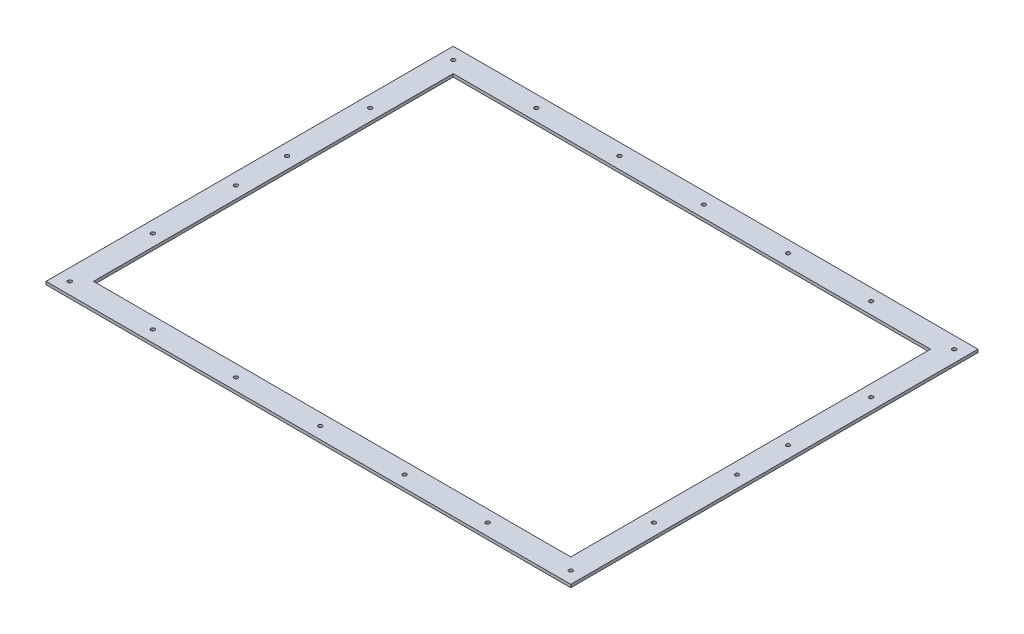
ISO-10303-21;
HEADER;
FILE_DESCRIPTION(('STEP AP214'),'2;1');
FILE_NAME('part.step','',(''),(''),'','','');
FILE_SCHEMA(('AUTOMOTIVE_DESIGN { 1 0 10303 214 1 1 1 1 }'));
ENDSEC;
DATA;
#1=APPLICATION_CONTEXT('core data for automotive mechanical design processes');
#2=APPLICATION_PROTOCOL_DEFINITION('international standard','automotive_design',2000,#1);
#3=PRODUCT_CONTEXT('',#1,'mechanical');
#4=PRODUCT('Part','Part','',(#3));
#5=PRODUCT_RELATED_PRODUCT_CATEGORY('part','',(#4));
#6=PRODUCT_DEFINITION_FORMATION('','',#4);
#7=PRODUCT_DEFINITION_CONTEXT('part definition',#1,'design');
#8=PRODUCT_DEFINITION('design','',#6,#7);
#9=PRODUCT_DEFINITION_SHAPE('','',#8);
#10=(LENGTH_UNIT() NAMED_UNIT(*) SI_UNIT(.MILLI.,.METRE.));
#11=(NAMED_UNIT(*) PLANE_ANGLE_UNIT() SI_UNIT($,.RADIAN.));
#12=(NAMED_UNIT(*) SI_UNIT($,.STERADIAN.) SOLID_ANGLE_UNIT());
#13=UNCERTAINTY_MEASURE_WITH_UNIT(LENGTH_MEASURE(1.E-05),#10,'distance_accuracy_value','');
#14=(GEOMETRIC_REPRESENTATION_CONTEXT(3) GLOBAL_UNCERTAINTY_ASSIGNED_CONTEXT((#13)) GLOBAL_UNIT_ASSIGNED_CONTEXT((#10,
#11,#12)) REPRESENTATION_CONTEXT('',''));
#15=CARTESIAN_POINT('',(0.,0.,0.));
#16=DIRECTION('',(0.,0.,1.));
#17=DIRECTION('',(1.,0.,0.));
#18=AXIS2_PLACEMENT_3D('',#15,#16,#17);
#19=CARTESIAN_POINT('',(0.,2.5,0.));
#20=DIRECTION('',(0.,-1.,0.));
#21=DIRECTION('',(0.,0.,-1.));
#22=AXIS2_PLACEMENT_3D('',#19,#20,#21);
#23=PLANE('',#22);
#24=CARTESIAN_POINT('',(-282.,2.5,323.));
#25=DIRECTION('',(0.,1.,0.));
#26=DIRECTION('',(0.,0.,-1.));
#27=AXIS2_PLACEMENT_3D('',#24,#25,#26);
#28=CIRCLE('',#27,3.24999999999995);
#29=CARTESIAN_POINT('',(-282.,2.5,319.75));
#30=VERTEX_POINT('',#29);
#31=EDGE_CURVE('E383',#30,#30,#28,.T.);
#32=ORIENTED_EDGE('',*,*,#31,.F.);
#33=EDGE_LOOP('',(#32));
#34=FACE_BOUND('',#33,.T.);
#35=CARTESIAN_POINT('',(-422.,2.5,42.9999999999999));
#36=DIRECTION('',(0.,1.,0.));
#37=DIRECTION('',(0.,0.,-1.));
#38=AXIS2_PLACEMENT_3D('',#35,#36,#37);
#39=CIRCLE('',#38,3.24999999999995);
#40=CARTESIAN_POINT('',(-422.,2.5,39.75));
#41=VERTEX_POINT('',#40);
#42=EDGE_CURVE('E372',#41,#41,#39,.T.);
#43=ORIENTED_EDGE('',*,*,#42,.F.);
#44=EDGE_LOOP('',(#43));
#45=FACE_BOUND('',#44,.T.);
#46=CARTESIAN_POINT('',(-422.,2.5,183.));
#47=DIRECTION('',(0.,1.,0.));
#48=DIRECTION('',(0.,0.,-1.));
#49=AXIS2_PLACEMENT_3D('',#46,#47,#48);
#50=CIRCLE('',#49,3.24999999999995);
#51=CARTESIAN_POINT('',(-422.,2.5,179.75));
#52=VERTEX_POINT('',#51);
#53=EDGE_CURVE('E373',#52,#52,#50,.T.);
#54=ORIENTED_EDGE('',*,*,#53,.F.);
#55=EDGE_LOOP('',(#54));
#56=FACE_BOUND('',#55,.T.);
#57=CARTESIAN_POINT('',(-422.,2.5,-183.));
#58=DIRECTION('',(0.,1.,0.));
#59=DIRECTION('',(0.,0.,1.));
#60=AXIS2_PLACEMENT_3D('',#57,#58,#59);
#61=CIRCLE('',#60,3.24999999999995);
#62=CARTESIAN_POINT('',(-422.,2.5,-179.75));
#63=VERTEX_POINT('',#62);
#64=EDGE_CURVE('E329',#63,#63,#61,.T.);
#65=ORIENTED_EDGE('',*,*,#64,.F.);
#66=EDGE_LOOP('',(#65));
#67=FACE_BOUND('',#66,.T.);
#68=CARTESIAN_POINT('',(-142.,2.5,323.));
#69=DIRECTION('',(0.,1.,0.));
#70=DIRECTION('',(0.,0.,-1.));
#71=AXIS2_PLACEMENT_3D('',#68,#69,#70);
#72=CIRCLE('',#71,3.24999999999995);
#73=CARTESIAN_POINT('',(-142.,2.5,319.75));
#74=VERTEX_POINT('',#73);
#75=EDGE_CURVE('E365',#74,#74,#72,.T.);
#76=ORIENTED_EDGE('',*,*,#75,.F.);
#77=EDGE_LOOP('',(#76));
#78=FACE_BOUND('',#77,.T.);
#79=CARTESIAN_POINT('',(-1.32813855748502E-13,2.5,323.));
#80=DIRECTION('',(0.,1.,0.));
#81=DIRECTION('',(0.,0.,-1.));
#82=AXIS2_PLACEMENT_3D('',#79,#80,#81);
#83=CIRCLE('',#82,3.25);
#84=CARTESIAN_POINT('',(-1.32813855748502E-13,2.5,319.75));
#85=VERTEX_POINT('',#84);
#86=EDGE_CURVE('E359',#85,#85,#83,.T.);
#87=ORIENTED_EDGE('',*,*,#86,.F.);
#88=EDGE_LOOP('',(#87));
#89=FACE_BOUND('',#88,.T.);
#90=CARTESIAN_POINT('',(142.,2.5,323.));
#91=DIRECTION('',(0.,1.,0.));
#92=DIRECTION('',(0.,0.,1.));
#93=AXIS2_PLACEMENT_3D('',#90,#91,#92);
#94=CIRCLE('',#93,3.24999999999995);
#95=CARTESIAN_POINT('',(142.,2.5,326.25));
#96=VERTEX_POINT('',#95);
#97=EDGE_CURVE('E353',#96,#96,#94,.T.);
#98=ORIENTED_EDGE('',*,*,#97,.F.);
#99=EDGE_LOOP('',(#98));
#100=FACE_BOUND('',#99,.T.);
#101=CARTESIAN_POINT('',(282.,2.5,323.));
#102=DIRECTION('',(0.,1.,0.));
#103=DIRECTION('',(0.,0.,1.));
#104=AXIS2_PLACEMENT_3D('',#101,#102,#103);
#105=CIRCLE('',#104,3.24999999999995);
#106=CARTESIAN_POINT('',(282.,2.5,326.25));
#107=VERTEX_POINT('',#106);
#108=EDGE_CURVE('E347',#107,#107,#105,.T.);
#109=ORIENTED_EDGE('',*,*,#108,.F.);
#110=EDGE_LOOP('',(#109));
#111=FACE_BOUND('',#110,.T.);
#112=CARTESIAN_POINT('',(422.,2.5,-323.));
#113=DIRECTION('',(0.,1.,0.));
#114=DIRECTION('',(0.,0.,-1.));
#115=AXIS2_PLACEMENT_3D('',#112,#113,#114);
#116=CIRCLE('',#115,3.25000000000023);
#117=CARTESIAN_POINT('',(422.,2.5,-326.25));
#118=VERTEX_POINT('',#117);
#119=EDGE_CURVE('E419',#118,#118,#116,.T.);
#120=ORIENTED_EDGE('',*,*,#119,.F.);
#121=EDGE_LOOP('',(#120));
#122=FACE_BOUND('',#121,.T.);
#123=CARTESIAN_POINT('',(422.,2.5,323.));
#124=DIRECTION('',(0.,1.,0.));
#125=DIRECTION('',(0.,0.,1.));
#126=AXIS2_PLACEMENT_3D('',#123,#124,#125);
#127=CIRCLE('',#126,3.25000000000025);
#128=CARTESIAN_POINT('',(422.,2.5,326.25));
#129=VERTEX_POINT('',#128);
#130=EDGE_CURVE('E425',#129,#129,#127,.T.);
#131=ORIENTED_EDGE('',*,*,#130,.F.);
#132=EDGE_LOOP('',(#131));
#133=FACE_BOUND('',#132,.T.);
#134=CARTESIAN_POINT('',(-422.,2.5,323.));
#135=DIRECTION('',(0.,1.,0.));
#136=DIRECTION('',(0.,0.,-1.));
#137=AXIS2_PLACEMENT_3D('',#134,#135,#136);
#138=CIRCLE('',#137,3.24999999999994);
#139=CARTESIAN_POINT('',(-422.,2.5,319.75));
#140=VERTEX_POINT('',#139);
#141=EDGE_CURVE('E431',#140,#140,#138,.T.);
#142=ORIENTED_EDGE('',*,*,#141,.F.);
#143=EDGE_LOOP('',(#142));
#144=FACE_BOUND('',#143,.T.);
#145=CARTESIAN_POINT('',(-282.,2.5,-323.));
#146=DIRECTION('',(0.,1.,0.));
#147=DIRECTION('',(0.,0.,1.));
#148=AXIS2_PLACEMENT_3D('',#145,#146,#147);
#149=CIRCLE('',#148,3.24999999999995);
#150=CARTESIAN_POINT('',(-282.,2.5,-319.75));
#151=VERTEX_POINT('',#150);
#152=EDGE_CURVE('E394',#151,#151,#149,.T.);
#153=ORIENTED_EDGE('',*,*,#152,.F.);
#154=EDGE_LOOP('',(#153));
#155=FACE_BOUND('',#154,.T.);
#156=CARTESIAN_POINT('',(-142.,2.5,-323.));
#157=DIRECTION('',(0.,1.,0.));
#158=DIRECTION('',(0.,0.,1.));
#159=AXIS2_PLACEMENT_3D('',#156,#157,#158);
#160=CIRCLE('',#159,3.24999999999995);
#161=CARTESIAN_POINT('',(-142.,2.5,-319.75));
#162=VERTEX_POINT('',#161);
#163=EDGE_CURVE('E395',#162,#162,#160,.T.);
#164=ORIENTED_EDGE('',*,*,#163,.F.);
#165=EDGE_LOOP('',(#164));
#166=FACE_BOUND('',#165,.T.);
#167=CARTESIAN_POINT('',(-1.32813855748502E-13,2.5,-323.));
#168=DIRECTION('',(0.,1.,0.));
#169=DIRECTION('',(0.,0.,1.));
#170=AXIS2_PLACEMENT_3D('',#167,#168,#169);
#171=CIRCLE('',#170,3.25);
#172=CARTESIAN_POINT('',(-1.32813855748502E-13,2.5,-319.75));
#173=VERTEX_POINT('',#172);
#174=EDGE_CURVE('E401',#173,#173,#171,.T.);
#175=ORIENTED_EDGE('',*,*,#174,.F.);
#176=EDGE_LOOP('',(#175));
#177=FACE_BOUND('',#176,.T.);
#178=CARTESIAN_POINT('',(142.,2.5,-323.));
#179=DIRECTION('',(0.,1.,0.));
#180=DIRECTION('',(0.,0.,-1.));
#181=AXIS2_PLACEMENT_3D('',#178,#179,#180);
#182=CIRCLE('',#181,3.24999999999995);
#183=CARTESIAN_POINT('',(142.,2.5,-326.25));
#184=VERTEX_POINT('',#183);
#185=EDGE_CURVE('E407',#184,#184,#182,.T.);
#186=ORIENTED_EDGE('',*,*,#185,.F.);
#187=EDGE_LOOP('',(#186));
#188=FACE_BOUND('',#187,.T.);
#189=CARTESIAN_POINT('',(282.,2.5,-323.));
#190=DIRECTION('',(0.,1.,0.));
#191=DIRECTION('',(0.,0.,-1.));
#192=AXIS2_PLACEMENT_3D('',#189,#190,#191);
#193=CIRCLE('',#192,3.24999999999995);
#194=CARTESIAN_POINT('',(282.,2.5,-326.25));
#195=VERTEX_POINT('',#194);
#196=EDGE_CURVE('E346',#195,#195,#193,.T.);
#197=ORIENTED_EDGE('',*,*,#196,.F.);
#198=EDGE_LOOP('',(#197));
#199=FACE_BOUND('',#198,.T.);
#200=CARTESIAN_POINT('',(422.,2.5,-43.));
#201=DIRECTION('',(0.,1.,0.));
#202=DIRECTION('',(0.,0.,-1.));
#203=AXIS2_PLACEMENT_3D('',#200,#201,#202);
#204=CIRCLE('',#203,3.24999999999995);
#205=CARTESIAN_POINT('',(422.,2.5,-46.25));
#206=VERTEX_POINT('',#205);
#207=EDGE_CURVE('E320',#206,#206,#204,.T.);
#208=ORIENTED_EDGE('',*,*,#207,.F.);
#209=EDGE_LOOP('',(#208));
#210=FACE_BOUND('',#209,.T.);
#211=CARTESIAN_POINT('',(422.,2.5,42.9999999999998));
#212=DIRECTION('',(0.,1.,0.));
#213=DIRECTION('',(0.,0.,1.));
#214=AXIS2_PLACEMENT_3D('',#211,#212,#213);
#215=CIRCLE('',#214,3.24999999999995);
#216=CARTESIAN_POINT('',(422.,2.5,46.2499999999998));
#217=VERTEX_POINT('',#216);
#218=EDGE_CURVE('E313',#217,#217,#215,.T.);
#219=ORIENTED_EDGE('',*,*,#218,.F.);
#220=EDGE_LOOP('',(#219));
#221=FACE_BOUND('',#220,.T.);
#222=CARTESIAN_POINT('',(422.,2.5,183.));
#223=DIRECTION('',(0.,1.,0.));
#224=DIRECTION('',(0.,0.,1.));
#225=AXIS2_PLACEMENT_3D('',#222,#223,#224);
#226=CIRCLE('',#225,3.24999999999995);
#227=CARTESIAN_POINT('',(422.,2.5,186.25));
#228=VERTEX_POINT('',#227);
#229=EDGE_CURVE('E317',#228,#228,#226,.T.);
#230=ORIENTED_EDGE('',*,*,#229,.F.);
#231=EDGE_LOOP('',(#230));
#232=FACE_BOUND('',#231,.T.);
#233=CARTESIAN_POINT('',(-422.,2.5,-42.9999999999999));
#234=DIRECTION('',(0.,1.,0.));
#235=DIRECTION('',(0.,0.,1.));
#236=AXIS2_PLACEMENT_3D('',#233,#234,#235);
#237=CIRCLE('',#236,3.24999999999995);
#238=CARTESIAN_POINT('',(-422.,2.5,-39.75));
#239=VERTEX_POINT('',#238);
#240=EDGE_CURVE('E330',#239,#239,#237,.T.);
#241=ORIENTED_EDGE('',*,*,#240,.F.);
#242=EDGE_LOOP('',(#241));
#243=FACE_BOUND('',#242,.T.);
#244=CARTESIAN_POINT('',(422.,2.5,-183.));
#245=DIRECTION('',(0.,1.,0.));
#246=DIRECTION('',(0.,0.,-1.));
#247=AXIS2_PLACEMENT_3D('',#244,#245,#246);
#248=CIRCLE('',#247,3.24999999999995);
#249=CARTESIAN_POINT('',(422.,2.5,-186.25));
#250=VERTEX_POINT('',#249);
#251=EDGE_CURVE('E340',#250,#250,#248,.T.);
#252=ORIENTED_EDGE('',*,*,#251,.F.);
#253=EDGE_LOOP('',(#252));
#254=FACE_BOUND('',#253,.T.);
#255=CARTESIAN_POINT('',(-422.,2.5,-323.));
#256=DIRECTION('',(0.,1.,0.));
#257=DIRECTION('',(0.,0.,1.));
#258=AXIS2_PLACEMENT_3D('',#255,#256,#257);
#259=CIRCLE('',#258,3.24999999999995);
#260=CARTESIAN_POINT('',(-422.,2.5,-319.75));
#261=VERTEX_POINT('',#260);
#262=EDGE_CURVE('E418',#261,#261,#259,.T.);
#263=ORIENTED_EDGE('',*,*,#262,.F.);
#264=EDGE_LOOP('',(#263));
#265=FACE_BOUND('',#264,.T.);
#266=DIRECTION('',(1.,0.,0.));
#267=VECTOR('',#266,1.);
#268=CARTESIAN_POINT('',(442.,2.5,343.));
#269=LINE('',#268,#267);
#270=CARTESIAN_POINT('',(-442.,2.5,343.));
#271=VERTEX_POINT('',#270);
#272=CARTESIAN_POINT('',(442.,2.5,343.));
#273=VERTEX_POINT('',#272);
#274=EDGE_CURVE('E138',#271,#273,#269,.T.);
#275=ORIENTED_EDGE('',*,*,#274,.T.);
#276=DIRECTION('',(0.,0.,-1.));
#277=VECTOR('',#276,1.);
#278=CARTESIAN_POINT('',(442.,2.5,343.));
#279=LINE('',#278,#277);
#280=CARTESIAN_POINT('',(442.,2.5,-343.));
#281=VERTEX_POINT('',#280);
#282=EDGE_CURVE('E141',#273,#281,#279,.T.);
#283=ORIENTED_EDGE('',*,*,#282,.T.);
#284=DIRECTION('',(-1.,0.,0.));
#285=VECTOR('',#284,1.);
#286=CARTESIAN_POINT('',(442.,2.5,-343.));
#287=LINE('',#286,#285);
#288=CARTESIAN_POINT('',(-442.,2.5,-343.));
#289=VERTEX_POINT('',#288);
#290=EDGE_CURVE('E144',#281,#289,#287,.T.);
#291=ORIENTED_EDGE('',*,*,#290,.T.);
#292=DIRECTION('',(0.,0.,1.));
#293=VECTOR('',#292,1.);
#294=CARTESIAN_POINT('',(-442.,2.5,343.));
#295=LINE('',#294,#293);
#296=EDGE_CURVE('E146',#289,#271,#295,.T.);
#297=ORIENTED_EDGE('',*,*,#296,.T.);
#298=EDGE_LOOP('',(#275,#283,#291,#297));
#299=FACE_BOUND('',#298,.T.);
#300=DIRECTION('',(0.,0.,1.));
#301=VECTOR('',#300,1.);
#302=CARTESIAN_POINT('',(-402.,2.5,303.));
#303=LINE('',#302,#301);
#304=CARTESIAN_POINT('',(-402.,2.5,-303.));
#305=VERTEX_POINT('',#304);
#306=CARTESIAN_POINT('',(-402.,2.5,303.));
#307=VERTEX_POINT('',#306);
#308=EDGE_CURVE('E100',#305,#307,#303,.T.);
#309=ORIENTED_EDGE('',*,*,#308,.F.);
#310=DIRECTION('',(-1.,0.,0.));
#311=VECTOR('',#310,1.);
#312=CARTESIAN_POINT('',(402.,2.5,-303.));
#313=LINE('',#312,#311);
#314=CARTESIAN_POINT('',(402.,2.5,-303.));
#315=VERTEX_POINT('',#314);
#316=EDGE_CURVE('E122',#315,#305,#313,.T.);
#317=ORIENTED_EDGE('',*,*,#316,.F.);
#318=DIRECTION('',(0.,0.,-1.));
#319=VECTOR('',#318,1.);
#320=CARTESIAN_POINT('',(402.,2.5,303.));
#321=LINE('',#320,#319);
#322=CARTESIAN_POINT('',(402.,2.5,303.));
#323=VERTEX_POINT('',#322);
#324=EDGE_CURVE('E120',#323,#315,#321,.T.);
#325=ORIENTED_EDGE('',*,*,#324,.F.);
#326=DIRECTION('',(1.,0.,0.));
#327=VECTOR('',#326,1.);
#328=CARTESIAN_POINT('',(402.,2.5,303.));
#329=LINE('',#328,#327);
#330=EDGE_CURVE('E108',#307,#323,#329,.T.);
#331=ORIENTED_EDGE('',*,*,#330,.F.);
#332=EDGE_LOOP('',(#309,#317,#325,#331));
#333=FACE_BOUND('',#332,.T.);
#334=ADVANCED_FACE('F35',(#34,#45,#56,#67,#78,#89,#100,#111,#122,#133,#144,#155,#166,#177,#188,
#199,#210,#221,#232,#243,#254,#265,#299,#333),#23,.F.);
#335=CARTESIAN_POINT('',(0.,-2.5,0.));
#336=DIRECTION('',(0.,-1.,0.));
#337=DIRECTION('',(0.,0.,-1.));
#338=AXIS2_PLACEMENT_3D('',#335,#336,#337);
#339=PLANE('',#338);
#340=CARTESIAN_POINT('',(-282.,-2.5,323.));
#341=DIRECTION('',(0.,1.,0.));
#342=DIRECTION('',(0.,0.,-1.));
#343=AXIS2_PLACEMENT_3D('',#340,#341,#342);
#344=CIRCLE('',#343,3.24999999999995);
#345=CARTESIAN_POINT('',(-282.,-2.5,319.75));
#346=VERTEX_POINT('',#345);
#347=EDGE_CURVE('E368',#346,#346,#344,.T.);
#348=ORIENTED_EDGE('',*,*,#347,.T.);
#349=EDGE_LOOP('',(#348));
#350=FACE_BOUND('',#349,.T.);
#351=CARTESIAN_POINT('',(-422.,-2.5,42.9999999999999));
#352=DIRECTION('',(0.,1.,0.));
#353=DIRECTION('',(0.,0.,-1.));
#354=AXIS2_PLACEMENT_3D('',#351,#352,#353);
#355=CIRCLE('',#354,3.24999999999995);
#356=CARTESIAN_POINT('',(-422.,-2.5,39.75));
#357=VERTEX_POINT('',#356);
#358=EDGE_CURVE('E386',#357,#357,#355,.T.);
#359=ORIENTED_EDGE('',*,*,#358,.T.);
#360=EDGE_LOOP('',(#359));
#361=FACE_BOUND('',#360,.T.);
#362=CARTESIAN_POINT('',(-422.,-2.5,183.));
#363=DIRECTION('',(0.,1.,0.));
#364=DIRECTION('',(0.,0.,-1.));
#365=AXIS2_PLACEMENT_3D('',#362,#363,#364);
#366=CIRCLE('',#365,3.24999999999995);
#367=CARTESIAN_POINT('',(-422.,-2.5,179.75));
#368=VERTEX_POINT('',#367);
#369=EDGE_CURVE('E369',#368,#368,#366,.T.);
#370=ORIENTED_EDGE('',*,*,#369,.T.);
#371=EDGE_LOOP('',(#370));
#372=FACE_BOUND('',#371,.T.);
#373=CARTESIAN_POINT('',(-422.,-2.5,-183.));
#374=DIRECTION('',(0.,1.,0.));
#375=DIRECTION('',(0.,0.,1.));
#376=AXIS2_PLACEMENT_3D('',#373,#374,#375);
#377=CIRCLE('',#376,3.24999999999995);
#378=CARTESIAN_POINT('',(-422.,-2.5,-179.75));
#379=VERTEX_POINT('',#378);
#380=EDGE_CURVE('E376',#379,#379,#377,.T.);
#381=ORIENTED_EDGE('',*,*,#380,.T.);
#382=EDGE_LOOP('',(#381));
#383=FACE_BOUND('',#382,.T.);
#384=CARTESIAN_POINT('',(-142.,-2.5,323.));
#385=DIRECTION('',(0.,1.,0.));
#386=DIRECTION('',(0.,0.,-1.));
#387=AXIS2_PLACEMENT_3D('',#384,#385,#386);
#388=CIRCLE('',#387,3.24999999999995);
#389=CARTESIAN_POINT('',(-142.,-2.5,319.75));
#390=VERTEX_POINT('',#389);
#391=EDGE_CURVE('E362',#390,#390,#388,.T.);
#392=ORIENTED_EDGE('',*,*,#391,.T.);
#393=EDGE_LOOP('',(#392));
#394=FACE_BOUND('',#393,.T.);
#395=CARTESIAN_POINT('',(-1.32813855748502E-13,-2.5,323.));
#396=DIRECTION('',(0.,1.,0.));
#397=DIRECTION('',(0.,0.,-1.));
#398=AXIS2_PLACEMENT_3D('',#395,#396,#397);
#399=CIRCLE('',#398,3.25);
#400=CARTESIAN_POINT('',(-1.32813855748502E-13,-2.5,319.75));
#401=VERTEX_POINT('',#400);
#402=EDGE_CURVE('E356',#401,#401,#399,.T.);
#403=ORIENTED_EDGE('',*,*,#402,.T.);
#404=EDGE_LOOP('',(#403));
#405=FACE_BOUND('',#404,.T.);
#406=CARTESIAN_POINT('',(142.,-2.5,323.));
#407=DIRECTION('',(0.,1.,0.));
#408=DIRECTION('',(0.,0.,1.));
#409=AXIS2_PLACEMENT_3D('',#406,#407,#408);
#410=CIRCLE('',#409,3.24999999999995);
#411=CARTESIAN_POINT('',(142.,-2.5,326.25));
#412=VERTEX_POINT('',#411);
#413=EDGE_CURVE('E350',#412,#412,#410,.T.);
#414=ORIENTED_EDGE('',*,*,#413,.T.);
#415=EDGE_LOOP('',(#414));
#416=FACE_BOUND('',#415,.T.);
#417=CARTESIAN_POINT('',(282.,-2.5,323.));
#418=DIRECTION('',(0.,1.,0.));
#419=DIRECTION('',(0.,0.,1.));
#420=AXIS2_PLACEMENT_3D('',#417,#418,#419);
#421=CIRCLE('',#420,3.24999999999995);
#422=CARTESIAN_POINT('',(282.,-2.5,326.25));
#423=VERTEX_POINT('',#422);
#424=EDGE_CURVE('E343',#423,#423,#421,.T.);
#425=ORIENTED_EDGE('',*,*,#424,.T.);
#426=EDGE_LOOP('',(#425));
#427=FACE_BOUND('',#426,.T.);
#428=CARTESIAN_POINT('',(422.,-2.5,-323.));
#429=DIRECTION('',(0.,1.,0.));
#430=DIRECTION('',(0.,0.,-1.));
#431=AXIS2_PLACEMENT_3D('',#428,#429,#430);
#432=CIRCLE('',#431,3.25000000000023);
#433=CARTESIAN_POINT('',(422.,-2.5,-326.25));
#434=VERTEX_POINT('',#433);
#435=EDGE_CURVE('E415',#434,#434,#432,.T.);
#436=ORIENTED_EDGE('',*,*,#435,.T.);
#437=EDGE_LOOP('',(#436));
#438=FACE_BOUND('',#437,.T.);
#439=CARTESIAN_POINT('',(422.,-2.5,323.));
#440=DIRECTION('',(0.,1.,0.));
#441=DIRECTION('',(0.,0.,1.));
#442=AXIS2_PLACEMENT_3D('',#439,#440,#441);
#443=CIRCLE('',#442,3.25000000000025);
#444=CARTESIAN_POINT('',(422.,-2.5,326.25));
#445=VERTEX_POINT('',#444);
#446=EDGE_CURVE('E422',#445,#445,#443,.T.);
#447=ORIENTED_EDGE('',*,*,#446,.T.);
#448=EDGE_LOOP('',(#447));
#449=FACE_BOUND('',#448,.T.);
#450=CARTESIAN_POINT('',(-422.,-2.5,323.));
#451=DIRECTION('',(0.,1.,0.));
#452=DIRECTION('',(0.,0.,-1.));
#453=AXIS2_PLACEMENT_3D('',#450,#451,#452);
#454=CIRCLE('',#453,3.24999999999994);
#455=CARTESIAN_POINT('',(-422.,-2.5,319.75));
#456=VERTEX_POINT('',#455);
#457=EDGE_CURVE('E428',#456,#456,#454,.T.);
#458=ORIENTED_EDGE('',*,*,#457,.T.);
#459=EDGE_LOOP('',(#458));
#460=FACE_BOUND('',#459,.T.);
#461=CARTESIAN_POINT('',(-282.,-2.5,-323.));
#462=DIRECTION('',(0.,1.,0.));
#463=DIRECTION('',(0.,0.,1.));
#464=AXIS2_PLACEMENT_3D('',#461,#462,#463);
#465=CIRCLE('',#464,3.24999999999995);
#466=CARTESIAN_POINT('',(-282.,-2.5,-319.75));
#467=VERTEX_POINT('',#466);
#468=EDGE_CURVE('E434',#467,#467,#465,.T.);
#469=ORIENTED_EDGE('',*,*,#468,.T.);
#470=EDGE_LOOP('',(#469));
#471=FACE_BOUND('',#470,.T.);
#472=CARTESIAN_POINT('',(-142.,-2.5,-323.));
#473=DIRECTION('',(0.,1.,0.));
#474=DIRECTION('',(0.,0.,1.));
#475=AXIS2_PLACEMENT_3D('',#472,#473,#474);
#476=CIRCLE('',#475,3.24999999999995);
#477=CARTESIAN_POINT('',(-142.,-2.5,-319.75));
#478=VERTEX_POINT('',#477);
#479=EDGE_CURVE('E391',#478,#478,#476,.T.);
#480=ORIENTED_EDGE('',*,*,#479,.T.);
#481=EDGE_LOOP('',(#480));
#482=FACE_BOUND('',#481,.T.);
#483=CARTESIAN_POINT('',(-1.32813855748502E-13,-2.5,-323.));
#484=DIRECTION('',(0.,1.,0.));
#485=DIRECTION('',(0.,0.,1.));
#486=AXIS2_PLACEMENT_3D('',#483,#484,#485);
#487=CIRCLE('',#486,3.25);
#488=CARTESIAN_POINT('',(-1.32813855748502E-13,-2.5,-319.75));
#489=VERTEX_POINT('',#488);
#490=EDGE_CURVE('E398',#489,#489,#487,.T.);
#491=ORIENTED_EDGE('',*,*,#490,.T.);
#492=EDGE_LOOP('',(#491));
#493=FACE_BOUND('',#492,.T.);
#494=CARTESIAN_POINT('',(142.,-2.5,-323.));
#495=DIRECTION('',(0.,1.,0.));
#496=DIRECTION('',(0.,0.,-1.));
#497=AXIS2_PLACEMENT_3D('',#494,#495,#496);
#498=CIRCLE('',#497,3.24999999999995);
#499=CARTESIAN_POINT('',(142.,-2.5,-326.25));
#500=VERTEX_POINT('',#499);
#501=EDGE_CURVE('E404',#500,#500,#498,.T.);
#502=ORIENTED_EDGE('',*,*,#501,.T.);
#503=EDGE_LOOP('',(#502));
#504=FACE_BOUND('',#503,.T.);
#505=CARTESIAN_POINT('',(282.,-2.5,-323.));
#506=DIRECTION('',(0.,1.,0.));
#507=DIRECTION('',(0.,0.,-1.));
#508=AXIS2_PLACEMENT_3D('',#505,#506,#507);
#509=CIRCLE('',#508,3.24999999999995);
#510=CARTESIAN_POINT('',(282.,-2.5,-326.25));
#511=VERTEX_POINT('',#510);
#512=EDGE_CURVE('E410',#511,#511,#509,.T.);
#513=ORIENTED_EDGE('',*,*,#512,.T.);
#514=EDGE_LOOP('',(#513));
#515=FACE_BOUND('',#514,.T.);
#516=CARTESIAN_POINT('',(422.,-2.5,-43.));
#517=DIRECTION('',(0.,1.,0.));
#518=DIRECTION('',(0.,0.,-1.));
#519=AXIS2_PLACEMENT_3D('',#516,#517,#518);
#520=CIRCLE('',#519,3.24999999999995);
#521=CARTESIAN_POINT('',(422.,-2.5,-46.25));
#522=VERTEX_POINT('',#521);
#523=EDGE_CURVE('E315',#522,#522,#520,.T.);
#524=ORIENTED_EDGE('',*,*,#523,.T.);
#525=EDGE_LOOP('',(#524));
#526=FACE_BOUND('',#525,.T.);
#527=CARTESIAN_POINT('',(422.,-2.5,42.9999999999998));
#528=DIRECTION('',(0.,1.,0.));
#529=DIRECTION('',(0.,0.,1.));
#530=AXIS2_PLACEMENT_3D('',#527,#528,#529);
#531=CIRCLE('',#530,3.24999999999995);
#532=CARTESIAN_POINT('',(422.,-2.5,46.2499999999998));
#533=VERTEX_POINT('',#532);
#534=EDGE_CURVE('E310',#533,#533,#531,.T.);
#535=ORIENTED_EDGE('',*,*,#534,.T.);
#536=EDGE_LOOP('',(#535));
#537=FACE_BOUND('',#536,.T.);
#538=CARTESIAN_POINT('',(422.,-2.5,183.));
#539=DIRECTION('',(0.,1.,0.));
#540=DIRECTION('',(0.,0.,1.));
#541=AXIS2_PLACEMENT_3D('',#538,#539,#540);
#542=CIRCLE('',#541,3.24999999999995);
#543=CARTESIAN_POINT('',(422.,-2.5,186.25));
#544=VERTEX_POINT('',#543);
#545=EDGE_CURVE('E333',#544,#544,#542,.T.);
#546=ORIENTED_EDGE('',*,*,#545,.T.);
#547=EDGE_LOOP('',(#546));
#548=FACE_BOUND('',#547,.T.);
#549=CARTESIAN_POINT('',(-422.,-2.5,-42.9999999999999));
#550=DIRECTION('',(0.,1.,0.));
#551=DIRECTION('',(0.,0.,1.));
#552=AXIS2_PLACEMENT_3D('',#549,#550,#551);
#553=CIRCLE('',#552,3.24999999999995);
#554=CARTESIAN_POINT('',(-422.,-2.5,-39.75));
#555=VERTEX_POINT('',#554);
#556=EDGE_CURVE('E326',#555,#555,#553,.T.);
#557=ORIENTED_EDGE('',*,*,#556,.T.);
#558=EDGE_LOOP('',(#557));
#559=FACE_BOUND('',#558,.T.);
#560=CARTESIAN_POINT('',(422.,-2.5,-183.));
#561=DIRECTION('',(0.,1.,0.));
#562=DIRECTION('',(0.,0.,-1.));
#563=AXIS2_PLACEMENT_3D('',#560,#561,#562);
#564=CIRCLE('',#563,3.24999999999995);
#565=CARTESIAN_POINT('',(422.,-2.5,-186.25));
#566=VERTEX_POINT('',#565);
#567=EDGE_CURVE('E325',#566,#566,#564,.T.);
#568=ORIENTED_EDGE('',*,*,#567,.T.);
#569=EDGE_LOOP('',(#568));
#570=FACE_BOUND('',#569,.T.);
#571=CARTESIAN_POINT('',(-422.,-2.5,-323.));
#572=DIRECTION('',(0.,1.,0.));
#573=DIRECTION('',(0.,0.,1.));
#574=AXIS2_PLACEMENT_3D('',#571,#572,#573);
#575=CIRCLE('',#574,3.24999999999995);
#576=CARTESIAN_POINT('',(-422.,-2.5,-319.75));
#577=VERTEX_POINT('',#576);
#578=EDGE_CURVE('E128',#577,#577,#575,.T.);
#579=ORIENTED_EDGE('',*,*,#578,.T.);
#580=EDGE_LOOP('',(#579));
#581=FACE_BOUND('',#580,.T.);
#582=DIRECTION('',(1.,0.,0.));
#583=VECTOR('',#582,1.);
#584=CARTESIAN_POINT('',(442.,-2.5,343.));
#585=LINE('',#584,#583);
#586=CARTESIAN_POINT('',(-442.,-2.5,343.));
#587=VERTEX_POINT('',#586);
#588=CARTESIAN_POINT('',(442.,-2.5,343.));
#589=VERTEX_POINT('',#588);
#590=EDGE_CURVE('E116',#587,#589,#585,.T.);
#591=ORIENTED_EDGE('',*,*,#590,.F.);
#592=DIRECTION('',(0.,0.,1.));
#593=VECTOR('',#592,1.);
#594=CARTESIAN_POINT('',(-442.,-2.5,343.));
#595=LINE('',#594,#593);
#596=CARTESIAN_POINT('',(-442.,-2.5,-343.));
#597=VERTEX_POINT('',#596);
#598=EDGE_CURVE('E142',#597,#587,#595,.T.);
#599=ORIENTED_EDGE('',*,*,#598,.F.);
#600=DIRECTION('',(-1.,0.,0.));
#601=VECTOR('',#600,1.);
#602=CARTESIAN_POINT('',(442.,-2.5,-343.));
#603=LINE('',#602,#601);
#604=CARTESIAN_POINT('',(442.,-2.5,-343.));
#605=VERTEX_POINT('',#604);
#606=EDGE_CURVE('E153',#605,#597,#603,.T.);
#607=ORIENTED_EDGE('',*,*,#606,.F.);
#608=DIRECTION('',(0.,0.,-1.));
#609=VECTOR('',#608,1.);
#610=CARTESIAN_POINT('',(442.,-2.5,343.));
#611=LINE('',#610,#609);
#612=EDGE_CURVE('E151',#589,#605,#611,.T.);
#613=ORIENTED_EDGE('',*,*,#612,.F.);
#614=EDGE_LOOP('',(#591,#599,#607,#613));
#615=FACE_BOUND('',#614,.T.);
#616=DIRECTION('',(-1.,0.,0.));
#617=VECTOR('',#616,1.);
#618=CARTESIAN_POINT('',(402.,-2.5,-303.));
#619=LINE('',#618,#617);
#620=CARTESIAN_POINT('',(402.,-2.5,-303.));
#621=VERTEX_POINT('',#620);
#622=CARTESIAN_POINT('',(-402.,-2.5,-303.));
#623=VERTEX_POINT('',#622);
#624=EDGE_CURVE('E109',#621,#623,#619,.T.);
#625=ORIENTED_EDGE('',*,*,#624,.T.);
#626=DIRECTION('',(0.,0.,1.));
#627=VECTOR('',#626,1.);
#628=CARTESIAN_POINT('',(-402.,-2.5,303.));
#629=LINE('',#628,#627);
#630=CARTESIAN_POINT('',(-402.,-2.5,303.));
#631=VERTEX_POINT('',#630);
#632=EDGE_CURVE('E58',#623,#631,#629,.T.);
#633=ORIENTED_EDGE('',*,*,#632,.T.);
#634=DIRECTION('',(1.,0.,0.));
#635=VECTOR('',#634,1.);
#636=CARTESIAN_POINT('',(402.,-2.5,303.));
#637=LINE('',#636,#635);
#638=CARTESIAN_POINT('',(402.,-2.5,303.));
#639=VERTEX_POINT('',#638);
#640=EDGE_CURVE('E115',#631,#639,#637,.T.);
#641=ORIENTED_EDGE('',*,*,#640,.T.);
#642=DIRECTION('',(0.,0.,-1.));
#643=VECTOR('',#642,1.);
#644=CARTESIAN_POINT('',(402.,-2.5,303.));
#645=LINE('',#644,#643);
#646=EDGE_CURVE('E130',#639,#621,#645,.T.);
#647=ORIENTED_EDGE('',*,*,#646,.T.);
#648=EDGE_LOOP('',(#625,#633,#641,#647));
#649=FACE_BOUND('',#648,.T.);
#650=ADVANCED_FACE('F171',(#350,#361,#372,#383,#394,#405,#416,#427,#438,#449,#460,#471,#482,
#493,#504,#515,#526,#537,#548,#559,#570,#581,#615,#649),#339,.T.);
#651=CARTESIAN_POINT('',(442.,2.5,343.));
#652=DIRECTION('',(0.,0.,-1.));
#653=DIRECTION('',(-1.,0.,0.));
#654=AXIS2_PLACEMENT_3D('',#651,#652,#653);
#655=PLANE('',#654);
#656=ORIENTED_EDGE('',*,*,#590,.T.);
#657=DIRECTION('',(0.,-1.,0.));
#658=VECTOR('',#657,1.);
#659=CARTESIAN_POINT('',(442.,2.5,343.));
#660=LINE('',#659,#658);
#661=EDGE_CURVE('E11',#273,#589,#660,.T.);
#662=ORIENTED_EDGE('',*,*,#661,.F.);
#663=ORIENTED_EDGE('',*,*,#274,.F.);
#664=DIRECTION('',(0.,-1.,0.));
#665=VECTOR('',#664,1.);
#666=CARTESIAN_POINT('',(-442.,2.5,343.));
#667=LINE('',#666,#665);
#668=EDGE_CURVE('E148',#271,#587,#667,.T.);
#669=ORIENTED_EDGE('',*,*,#668,.T.);
#670=EDGE_LOOP('',(#656,#662,#663,#669));
#671=FACE_BOUND('',#670,.T.);
#672=ADVANCED_FACE('F37',(#671),#655,.F.);
#673=CARTESIAN_POINT('',(442.,2.5,343.));
#674=DIRECTION('',(-1.,0.,0.));
#675=DIRECTION('',(0.,0.,1.));
#676=AXIS2_PLACEMENT_3D('',#673,#674,#675);
#677=PLANE('',#676);
#678=ORIENTED_EDGE('',*,*,#612,.T.);
#679=DIRECTION('',(0.,-1.,0.));
#680=VECTOR('',#679,1.);
#681=CARTESIAN_POINT('',(442.,2.5,-343.));
#682=LINE('',#681,#680);
#683=EDGE_CURVE('E43',#281,#605,#682,.T.);
#684=ORIENTED_EDGE('',*,*,#683,.F.);
#685=ORIENTED_EDGE('',*,*,#282,.F.);
#686=ORIENTED_EDGE('',*,*,#661,.T.);
#687=EDGE_LOOP('',(#678,#684,#685,#686));
#688=FACE_BOUND('',#687,.T.);
#689=ADVANCED_FACE('F181',(#688),#677,.F.);
#690=CARTESIAN_POINT('',(442.,2.5,-343.));
#691=DIRECTION('',(0.,0.,1.));
#692=DIRECTION('',(1.,0.,0.));
#693=AXIS2_PLACEMENT_3D('',#690,#691,#692);
#694=PLANE('',#693);
#695=ORIENTED_EDGE('',*,*,#606,.T.);
#696=DIRECTION('',(0.,-1.,0.));
#697=VECTOR('',#696,1.);
#698=CARTESIAN_POINT('',(-442.,2.5,-343.));
#699=LINE('',#698,#697);
#700=EDGE_CURVE('E158',#289,#597,#699,.T.);
#701=ORIENTED_EDGE('',*,*,#700,.F.);
#702=ORIENTED_EDGE('',*,*,#290,.F.);
#703=ORIENTED_EDGE('',*,*,#683,.T.);
#704=EDGE_LOOP('',(#695,#701,#702,#703));
#705=FACE_BOUND('',#704,.T.);
#706=ADVANCED_FACE('F165',(#705),#694,.F.);
#707=CARTESIAN_POINT('',(-442.,2.5,343.));
#708=DIRECTION('',(1.,0.,0.));
#709=DIRECTION('',(0.,0.,-1.));
#710=AXIS2_PLACEMENT_3D('',#707,#708,#709);
#711=PLANE('',#710);
#712=ORIENTED_EDGE('',*,*,#598,.T.);
#713=ORIENTED_EDGE('',*,*,#668,.F.);
#714=ORIENTED_EDGE('',*,*,#296,.F.);
#715=ORIENTED_EDGE('',*,*,#700,.T.);
#716=EDGE_LOOP('',(#712,#713,#714,#715));
#717=FACE_BOUND('',#716,.T.);
#718=ADVANCED_FACE('F175',(#717),#711,.F.);
#719=CARTESIAN_POINT('',(-402.,2.5,303.));
#720=DIRECTION('',(1.,0.,0.));
#721=DIRECTION('',(0.,0.,-1.));
#722=AXIS2_PLACEMENT_3D('',#719,#720,#721);
#723=PLANE('',#722);
#724=ORIENTED_EDGE('',*,*,#632,.F.);
#725=DIRECTION('',(0.,-1.,0.));
#726=VECTOR('',#725,1.);
#727=CARTESIAN_POINT('',(-402.,2.5,-303.));
#728=LINE('',#727,#726);
#729=EDGE_CURVE('E104',#305,#623,#728,.T.);
#730=ORIENTED_EDGE('',*,*,#729,.F.);
#731=ORIENTED_EDGE('',*,*,#308,.T.);
#732=DIRECTION('',(0.,-1.,0.));
#733=VECTOR('',#732,1.);
#734=CARTESIAN_POINT('',(-402.,2.5,303.));
#735=LINE('',#734,#733);
#736=EDGE_CURVE('E103',#307,#631,#735,.T.);
#737=ORIENTED_EDGE('',*,*,#736,.T.);
#738=EDGE_LOOP('',(#724,#730,#731,#737));
#739=FACE_BOUND('',#738,.T.);
#740=ADVANCED_FACE('F102',(#739),#723,.T.);
#741=CARTESIAN_POINT('',(402.,2.5,303.));
#742=DIRECTION('',(0.,0.,-1.));
#743=DIRECTION('',(-1.,0.,0.));
#744=AXIS2_PLACEMENT_3D('',#741,#742,#743);
#745=PLANE('',#744);
#746=ORIENTED_EDGE('',*,*,#640,.F.);
#747=ORIENTED_EDGE('',*,*,#736,.F.);
#748=ORIENTED_EDGE('',*,*,#330,.T.);
#749=DIRECTION('',(0.,-1.,0.));
#750=VECTOR('',#749,1.);
#751=CARTESIAN_POINT('',(402.,2.5,303.));
#752=LINE('',#751,#750);
#753=EDGE_CURVE('E117',#323,#639,#752,.T.);
#754=ORIENTED_EDGE('',*,*,#753,.T.);
#755=EDGE_LOOP('',(#746,#747,#748,#754));
#756=FACE_BOUND('',#755,.T.);
#757=ADVANCED_FACE('F112',(#756),#745,.T.);
#758=CARTESIAN_POINT('',(402.,2.5,303.));
#759=DIRECTION('',(-1.,0.,0.));
#760=DIRECTION('',(0.,0.,1.));
#761=AXIS2_PLACEMENT_3D('',#758,#759,#760);
#762=PLANE('',#761);
#763=ORIENTED_EDGE('',*,*,#646,.F.);
#764=ORIENTED_EDGE('',*,*,#753,.F.);
#765=ORIENTED_EDGE('',*,*,#324,.T.);
#766=DIRECTION('',(0.,-1.,0.));
#767=VECTOR('',#766,1.);
#768=CARTESIAN_POINT('',(402.,2.5,-303.));
#769=LINE('',#768,#767);
#770=EDGE_CURVE('E50',#315,#621,#769,.T.);
#771=ORIENTED_EDGE('',*,*,#770,.T.);
#772=EDGE_LOOP('',(#763,#764,#765,#771));
#773=FACE_BOUND('',#772,.T.);
#774=ADVANCED_FACE('F208',(#773),#762,.T.);
#775=CARTESIAN_POINT('',(402.,2.5,-303.));
#776=DIRECTION('',(0.,0.,1.));
#777=DIRECTION('',(1.,0.,0.));
#778=AXIS2_PLACEMENT_3D('',#775,#776,#777);
#779=PLANE('',#778);
#780=ORIENTED_EDGE('',*,*,#624,.F.);
#781=ORIENTED_EDGE('',*,*,#770,.F.);
#782=ORIENTED_EDGE('',*,*,#316,.T.);
#783=ORIENTED_EDGE('',*,*,#729,.T.);
#784=EDGE_LOOP('',(#780,#781,#782,#783));
#785=FACE_BOUND('',#784,.T.);
#786=ADVANCED_FACE('F212',(#785),#779,.T.);
#787=CARTESIAN_POINT('',(-422.,-2.5,-323.));
#788=DIRECTION('',(0.,1.,0.));
#789=DIRECTION('',(0.,0.,1.));
#790=AXIS2_PLACEMENT_3D('',#787,#788,#789);
#791=CYLINDRICAL_SURFACE('',#790,3.24999999999995);
#792=ORIENTED_EDGE('',*,*,#578,.F.);
#793=EDGE_LOOP('',(#792));
#794=FACE_BOUND('',#793,.T.);
#795=ORIENTED_EDGE('',*,*,#262,.T.);
#796=EDGE_LOOP('',(#795));
#797=FACE_BOUND('',#796,.T.);
#798=ADVANCED_FACE('F218',(#794,#797),#791,.F.);
#799=CARTESIAN_POINT('',(422.,-2.5,-183.));
#800=DIRECTION('',(0.,1.,0.));
#801=DIRECTION('',(0.,0.,1.));
#802=AXIS2_PLACEMENT_3D('',#799,#800,#801);
#803=CYLINDRICAL_SURFACE('',#802,3.24999999999995);
#804=ORIENTED_EDGE('',*,*,#567,.F.);
#805=EDGE_LOOP('',(#804));
#806=FACE_BOUND('',#805,.T.);
#807=ORIENTED_EDGE('',*,*,#251,.T.);
#808=EDGE_LOOP('',(#807));
#809=FACE_BOUND('',#808,.T.);
#810=ADVANCED_FACE('F221',(#806,#809),#803,.F.);
#811=CARTESIAN_POINT('',(-422.,-2.5,-42.9999999999999));
#812=DIRECTION('',(0.,1.,0.));
#813=DIRECTION('',(0.,0.,1.));
#814=AXIS2_PLACEMENT_3D('',#811,#812,#813);
#815=CYLINDRICAL_SURFACE('',#814,3.24999999999995);
#816=ORIENTED_EDGE('',*,*,#556,.F.);
#817=EDGE_LOOP('',(#816));
#818=FACE_BOUND('',#817,.T.);
#819=ORIENTED_EDGE('',*,*,#240,.T.);
#820=EDGE_LOOP('',(#819));
#821=FACE_BOUND('',#820,.T.);
#822=ADVANCED_FACE('F290',(#818,#821),#815,.F.);
#823=CARTESIAN_POINT('',(422.,-2.5,183.));
#824=DIRECTION('',(0.,1.,0.));
#825=DIRECTION('',(0.,0.,1.));
#826=AXIS2_PLACEMENT_3D('',#823,#824,#825);
#827=CYLINDRICAL_SURFACE('',#826,3.24999999999995);
#828=ORIENTED_EDGE('',*,*,#545,.F.);
#829=EDGE_LOOP('',(#828));
#830=FACE_BOUND('',#829,.T.);
#831=ORIENTED_EDGE('',*,*,#229,.T.);
#832=EDGE_LOOP('',(#831));
#833=FACE_BOUND('',#832,.T.);
#834=ADVANCED_FACE('F292',(#830,#833),#827,.F.);
#835=CARTESIAN_POINT('',(422.,-2.5,42.9999999999998));
#836=DIRECTION('',(0.,1.,0.));
#837=DIRECTION('',(0.,0.,1.));
#838=AXIS2_PLACEMENT_3D('',#835,#836,#837);
#839=CYLINDRICAL_SURFACE('',#838,3.24999999999995);
#840=ORIENTED_EDGE('',*,*,#534,.F.);
#841=EDGE_LOOP('',(#840));
#842=FACE_BOUND('',#841,.T.);
#843=ORIENTED_EDGE('',*,*,#218,.T.);
#844=EDGE_LOOP('',(#843));
#845=FACE_BOUND('',#844,.T.);
#846=ADVANCED_FACE('F295',(#842,#845),#839,.F.);
#847=CARTESIAN_POINT('',(422.,-2.5,-43.));
#848=DIRECTION('',(0.,1.,0.));
#849=DIRECTION('',(0.,0.,1.));
#850=AXIS2_PLACEMENT_3D('',#847,#848,#849);
#851=CYLINDRICAL_SURFACE('',#850,3.24999999999995);
#852=ORIENTED_EDGE('',*,*,#523,.F.);
#853=EDGE_LOOP('',(#852));
#854=FACE_BOUND('',#853,.T.);
#855=ORIENTED_EDGE('',*,*,#207,.T.);
#856=EDGE_LOOP('',(#855));
#857=FACE_BOUND('',#856,.T.);
#858=ADVANCED_FACE('F245',(#854,#857),#851,.F.);
#859=CARTESIAN_POINT('',(282.,-2.5,-323.));
#860=DIRECTION('',(0.,1.,0.));
#861=DIRECTION('',(0.,0.,1.));
#862=AXIS2_PLACEMENT_3D('',#859,#860,#861);
#863=CYLINDRICAL_SURFACE('',#862,3.24999999999995);
#864=ORIENTED_EDGE('',*,*,#512,.F.);
#865=EDGE_LOOP('',(#864));
#866=FACE_BOUND('',#865,.T.);
#867=ORIENTED_EDGE('',*,*,#196,.T.);
#868=EDGE_LOOP('',(#867));
#869=FACE_BOUND('',#868,.T.);
#870=ADVANCED_FACE('F241',(#866,#869),#863,.F.);
#871=CARTESIAN_POINT('',(142.,-2.5,-323.));
#872=DIRECTION('',(0.,1.,0.));
#873=DIRECTION('',(0.,0.,1.));
#874=AXIS2_PLACEMENT_3D('',#871,#872,#873);
#875=CYLINDRICAL_SURFACE('',#874,3.24999999999995);
#876=ORIENTED_EDGE('',*,*,#501,.F.);
#877=EDGE_LOOP('',(#876));
#878=FACE_BOUND('',#877,.T.);
#879=ORIENTED_EDGE('',*,*,#185,.T.);
#880=EDGE_LOOP('',(#879));
#881=FACE_BOUND('',#880,.T.);
#882=ADVANCED_FACE('F244',(#878,#881),#875,.F.);
#883=CARTESIAN_POINT('',(-1.32813855748502E-13,-2.5,-323.));
#884=DIRECTION('',(0.,1.,0.));
#885=DIRECTION('',(0.,0.,1.));
#886=AXIS2_PLACEMENT_3D('',#883,#884,#885);
#887=CYLINDRICAL_SURFACE('',#886,3.25);
#888=ORIENTED_EDGE('',*,*,#490,.F.);
#889=EDGE_LOOP('',(#888));
#890=FACE_BOUND('',#889,.T.);
#891=ORIENTED_EDGE('',*,*,#174,.T.);
#892=EDGE_LOOP('',(#891));
#893=FACE_BOUND('',#892,.T.);
#894=ADVANCED_FACE('F249',(#890,#893),#887,.F.);
#895=CARTESIAN_POINT('',(-142.,-2.5,-323.));
#896=DIRECTION('',(0.,1.,0.));
#897=DIRECTION('',(0.,0.,1.));
#898=AXIS2_PLACEMENT_3D('',#895,#896,#897);
#899=CYLINDRICAL_SURFACE('',#898,3.24999999999995);
#900=ORIENTED_EDGE('',*,*,#479,.F.);
#901=EDGE_LOOP('',(#900));
#902=FACE_BOUND('',#901,.T.);
#903=ORIENTED_EDGE('',*,*,#163,.T.);
#904=EDGE_LOOP('',(#903));
#905=FACE_BOUND('',#904,.T.);
#906=ADVANCED_FACE('F227',(#902,#905),#899,.F.);
#907=CARTESIAN_POINT('',(-282.,-2.5,-323.));
#908=DIRECTION('',(0.,1.,0.));
#909=DIRECTION('',(0.,0.,1.));
#910=AXIS2_PLACEMENT_3D('',#907,#908,#909);
#911=CYLINDRICAL_SURFACE('',#910,3.24999999999995);
#912=ORIENTED_EDGE('',*,*,#468,.F.);
#913=EDGE_LOOP('',(#912));
#914=FACE_BOUND('',#913,.T.);
#915=ORIENTED_EDGE('',*,*,#152,.T.);
#916=EDGE_LOOP('',(#915));
#917=FACE_BOUND('',#916,.T.);
#918=ADVANCED_FACE('F223',(#914,#917),#911,.F.);
#919=CARTESIAN_POINT('',(-422.,-2.5,323.));
#920=DIRECTION('',(0.,1.,0.));
#921=DIRECTION('',(0.,0.,1.));
#922=AXIS2_PLACEMENT_3D('',#919,#920,#921);
#923=CYLINDRICAL_SURFACE('',#922,3.24999999999994);
#924=ORIENTED_EDGE('',*,*,#457,.F.);
#925=EDGE_LOOP('',(#924));
#926=FACE_BOUND('',#925,.T.);
#927=ORIENTED_EDGE('',*,*,#141,.T.);
#928=EDGE_LOOP('',(#927));
#929=FACE_BOUND('',#928,.T.);
#930=ADVANCED_FACE('F226',(#926,#929),#923,.F.);
#931=CARTESIAN_POINT('',(422.,-2.5,323.));
#932=DIRECTION('',(0.,1.,0.));
#933=DIRECTION('',(0.,0.,1.));
#934=AXIS2_PLACEMENT_3D('',#931,#932,#933);
#935=CYLINDRICAL_SURFACE('',#934,3.25000000000025);
#936=ORIENTED_EDGE('',*,*,#446,.F.);
#937=EDGE_LOOP('',(#936));
#938=FACE_BOUND('',#937,.T.);
#939=ORIENTED_EDGE('',*,*,#130,.T.);
#940=EDGE_LOOP('',(#939));
#941=FACE_BOUND('',#940,.T.);
#942=ADVANCED_FACE('F231',(#938,#941),#935,.F.);
#943=CARTESIAN_POINT('',(422.,-2.5,-323.));
#944=DIRECTION('',(0.,1.,0.));
#945=DIRECTION('',(0.,0.,1.));
#946=AXIS2_PLACEMENT_3D('',#943,#944,#945);
#947=CYLINDRICAL_SURFACE('',#946,3.25000000000023);
#948=ORIENTED_EDGE('',*,*,#435,.F.);
#949=EDGE_LOOP('',(#948));
#950=FACE_BOUND('',#949,.T.);
#951=ORIENTED_EDGE('',*,*,#119,.T.);
#952=EDGE_LOOP('',(#951));
#953=FACE_BOUND('',#952,.T.);
#954=ADVANCED_FACE('F235',(#950,#953),#947,.F.);
#955=CARTESIAN_POINT('',(282.,-2.5,323.));
#956=DIRECTION('',(0.,1.,0.));
#957=DIRECTION('',(0.,0.,1.));
#958=AXIS2_PLACEMENT_3D('',#955,#956,#957);
#959=CYLINDRICAL_SURFACE('',#958,3.24999999999995);
#960=ORIENTED_EDGE('',*,*,#424,.F.);
#961=EDGE_LOOP('',(#960));
#962=FACE_BOUND('',#961,.T.);
#963=ORIENTED_EDGE('',*,*,#108,.T.);
#964=EDGE_LOOP('',(#963));
#965=FACE_BOUND('',#964,.T.);
#966=ADVANCED_FACE('F239',(#962,#965),#959,.F.);
#967=CARTESIAN_POINT('',(142.,-2.5,323.));
#968=DIRECTION('',(0.,1.,0.));
#969=DIRECTION('',(0.,0.,1.));
#970=AXIS2_PLACEMENT_3D('',#967,#968,#969);
#971=CYLINDRICAL_SURFACE('',#970,3.24999999999995);
#972=ORIENTED_EDGE('',*,*,#413,.F.);
#973=EDGE_LOOP('',(#972));
#974=FACE_BOUND('',#973,.T.);
#975=ORIENTED_EDGE('',*,*,#97,.T.);
#976=EDGE_LOOP('',(#975));
#977=FACE_BOUND('',#976,.T.);
#978=ADVANCED_FACE('F280',(#974,#977),#971,.F.);
#979=CARTESIAN_POINT('',(-1.32813855748502E-13,-2.5,323.));
#980=DIRECTION('',(0.,1.,0.));
#981=DIRECTION('',(0.,0.,1.));
#982=AXIS2_PLACEMENT_3D('',#979,#980,#981);
#983=CYLINDRICAL_SURFACE('',#982,3.25);
#984=ORIENTED_EDGE('',*,*,#402,.F.);
#985=EDGE_LOOP('',(#984));
#986=FACE_BOUND('',#985,.T.);
#987=ORIENTED_EDGE('',*,*,#86,.T.);
#988=EDGE_LOOP('',(#987));
#989=FACE_BOUND('',#988,.T.);
#990=ADVANCED_FACE('F276',(#986,#989),#983,.F.);
#991=CARTESIAN_POINT('',(-142.,-2.5,323.));
#992=DIRECTION('',(0.,1.,0.));
#993=DIRECTION('',(0.,0.,1.));
#994=AXIS2_PLACEMENT_3D('',#991,#992,#993);
#995=CYLINDRICAL_SURFACE('',#994,3.24999999999995);
#996=ORIENTED_EDGE('',*,*,#391,.F.);
#997=EDGE_LOOP('',(#996));
#998=FACE_BOUND('',#997,.T.);
#999=ORIENTED_EDGE('',*,*,#75,.T.);
#1000=EDGE_LOOP('',(#999));
#1001=FACE_BOUND('',#1000,.T.);
#1002=ADVANCED_FACE('F269',(#998,#1001),#995,.F.);
#1003=CARTESIAN_POINT('',(-422.,-2.5,-183.));
#1004=DIRECTION('',(0.,1.,0.));
#1005=DIRECTION('',(0.,0.,1.));
#1006=AXIS2_PLACEMENT_3D('',#1003,#1004,#1005);
#1007=CYLINDRICAL_SURFACE('',#1006,3.24999999999995);
#1008=ORIENTED_EDGE('',*,*,#380,.F.);
#1009=EDGE_LOOP('',(#1008));
#1010=FACE_BOUND('',#1009,.T.);
#1011=ORIENTED_EDGE('',*,*,#64,.T.);
#1012=EDGE_LOOP('',(#1011));
#1013=FACE_BOUND('',#1012,.T.);
#1014=ADVANCED_FACE('F266',(#1010,#1013),#1007,.F.);
#1015=CARTESIAN_POINT('',(-422.,-2.5,183.));
#1016=DIRECTION('',(0.,1.,0.));
#1017=DIRECTION('',(0.,0.,1.));
#1018=AXIS2_PLACEMENT_3D('',#1015,#1016,#1017);
#1019=CYLINDRICAL_SURFACE('',#1018,3.24999999999995);
#1020=ORIENTED_EDGE('',*,*,#369,.F.);
#1021=EDGE_LOOP('',(#1020));
#1022=FACE_BOUND('',#1021,.T.);
#1023=ORIENTED_EDGE('',*,*,#53,.T.);
#1024=EDGE_LOOP('',(#1023));
#1025=FACE_BOUND('',#1024,.T.);
#1026=ADVANCED_FACE('F261',(#1022,#1025),#1019,.F.);
#1027=CARTESIAN_POINT('',(-422.,-2.5,42.9999999999999));
#1028=DIRECTION('',(0.,1.,0.));
#1029=DIRECTION('',(0.,0.,1.));
#1030=AXIS2_PLACEMENT_3D('',#1027,#1028,#1029);
#1031=CYLINDRICAL_SURFACE('',#1030,3.24999999999995);
#1032=ORIENTED_EDGE('',*,*,#358,.F.);
#1033=EDGE_LOOP('',(#1032));
#1034=FACE_BOUND('',#1033,.T.);
#1035=ORIENTED_EDGE('',*,*,#42,.T.);
#1036=EDGE_LOOP('',(#1035));
#1037=FACE_BOUND('',#1036,.T.);
#1038=ADVANCED_FACE('F257',(#1034,#1037),#1031,.F.);
#1039=CARTESIAN_POINT('',(-282.,-2.5,323.));
#1040=DIRECTION('',(0.,1.,0.));
#1041=DIRECTION('',(0.,0.,1.));
#1042=AXIS2_PLACEMENT_3D('',#1039,#1040,#1041);
#1043=CYLINDRICAL_SURFACE('',#1042,3.24999999999995);
#1044=ORIENTED_EDGE('',*,*,#347,.F.);
#1045=EDGE_LOOP('',(#1044));
#1046=FACE_BOUND('',#1045,.T.);
#1047=ORIENTED_EDGE('',*,*,#31,.T.);
#1048=EDGE_LOOP('',(#1047));
#1049=FACE_BOUND('',#1048,.T.);
#1050=ADVANCED_FACE('F260',(#1046,#1049),#1043,.F.);
#1051=CLOSED_SHELL('',(#334,#650,#672,#689,#706,#718,#740,#757,#774,#786,#798,#810,#822,#834,
#846,#858,#870,#882,#894,#906,#918,#930,#942,#954,#966,#978,#990,#1002,#1014,#1026,#1038,#1050));
#1052=MANIFOLD_SOLID_BREP('B2',#1051);
#1053=ADVANCED_BREP_SHAPE_REPRESENTATION('',(#18,#1052),#14);
#1054=SHAPE_DEFINITION_REPRESENTATION(#9,#1053);
ENDSEC;
END-ISO-10303-21;
